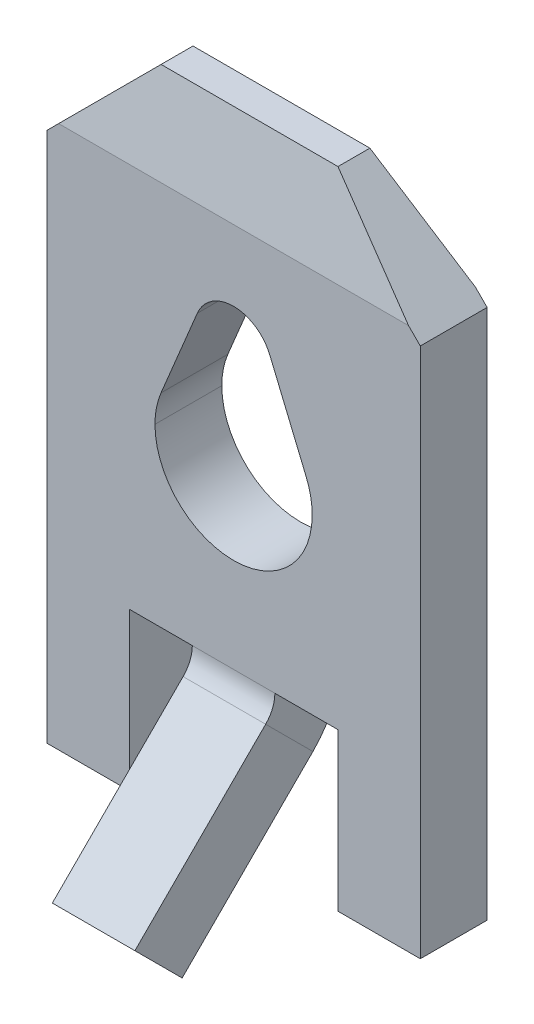
ISO-10303-21;
HEADER;
FILE_DESCRIPTION(('STEP AP214'),'2;1');
FILE_NAME('part.step','',(''),(''),'','','');
FILE_SCHEMA(('AUTOMOTIVE_DESIGN { 1 0 10303 214 1 1 1 1 }'));
ENDSEC;
DATA;
#1=APPLICATION_CONTEXT('core data for automotive mechanical design processes');
#2=APPLICATION_PROTOCOL_DEFINITION('international standard','automotive_design',2000,#1);
#3=PRODUCT_CONTEXT('',#1,'mechanical');
#4=PRODUCT('Part','Part','',(#3));
#5=PRODUCT_RELATED_PRODUCT_CATEGORY('part','',(#4));
#6=PRODUCT_DEFINITION_FORMATION('','',#4);
#7=PRODUCT_DEFINITION_CONTEXT('part definition',#1,'design');
#8=PRODUCT_DEFINITION('design','',#6,#7);
#9=PRODUCT_DEFINITION_SHAPE('','',#8);
#10=(LENGTH_UNIT() NAMED_UNIT(*) SI_UNIT(.MILLI.,.METRE.));
#11=(NAMED_UNIT(*) PLANE_ANGLE_UNIT() SI_UNIT($,.RADIAN.));
#12=(NAMED_UNIT(*) SI_UNIT($,.STERADIAN.) SOLID_ANGLE_UNIT());
#13=UNCERTAINTY_MEASURE_WITH_UNIT(LENGTH_MEASURE(1.E-05),#10,'distance_accuracy_value','');
#14=(GEOMETRIC_REPRESENTATION_CONTEXT(3) GLOBAL_UNCERTAINTY_ASSIGNED_CONTEXT((#13)) GLOBAL_UNIT_ASSIGNED_CONTEXT((#10,
#11,#12)) REPRESENTATION_CONTEXT('',''));
#15=CARTESIAN_POINT('',(0.,0.,0.));
#16=DIRECTION('',(0.,0.,1.));
#17=DIRECTION('',(1.,0.,0.));
#18=AXIS2_PLACEMENT_3D('',#15,#16,#17);
#19=CARTESIAN_POINT('',(2.9,3.84848421169575,2.03213960570058));
#20=DIRECTION('',(-1.,0.,0.));
#21=DIRECTION('',(0.,0.,1.));
#22=AXIS2_PLACEMENT_3D('',#19,#20,#21);
#23=PLANE('',#22);
#24=DIRECTION('',(0.,-0.707106781186544,-0.707106781186551));
#25=VECTOR('',#24,1.);
#26=CARTESIAN_POINT('',(2.9,3.39031190869815,2.49031190869817));
#27=LINE('',#26,#25);
#28=CARTESIAN_POINT('',(2.9,1.86715728752538,0.96715728752538));
#29=VERTEX_POINT('',#28);
#30=CARTESIAN_POINT('',(2.9,1.26611652351681,0.366116523516817));
#31=VERTEX_POINT('',#30);
#32=EDGE_CURVE('E302',#29,#31,#27,.T.);
#33=ORIENTED_EDGE('',*,*,#32,.F.);
#34=DIRECTION('',(0.,-0.707106781186547,0.707106781186549));
#35=VECTOR('',#34,1.);
#36=CARTESIAN_POINT('',(2.9,2.32532959052296,0.508984984527799));
#37=LINE('',#36,#35);
#38=CARTESIAN_POINT('',(2.9,0.204009246963322,2.63030532808745));
#39=VERTEX_POINT('',#38);
#40=EDGE_CURVE('E329',#29,#39,#37,.T.);
#41=ORIENTED_EDGE('',*,*,#40,.T.);
#42=DIRECTION('',(0.,0.707106781186549,0.707106781186546));
#43=VECTOR('',#42,1.);
#44=CARTESIAN_POINT('',(2.9,-0.397031517045243,2.02926456407888));
#45=LINE('',#44,#43);
#46=CARTESIAN_POINT('',(2.9,-0.397031517045243,2.02926456407888));
#47=VERTEX_POINT('',#46);
#48=EDGE_CURVE('E335',#47,#39,#45,.T.);
#49=ORIENTED_EDGE('',*,*,#48,.F.);
#50=DIRECTION('',(0.,0.707106781186547,-0.707106781186549));
#51=VECTOR('',#50,1.);
#52=CARTESIAN_POINT('',(2.9,1.72428882651439,-0.0920557794807646));
#53=LINE('',#52,#51);
#54=EDGE_CURVE('E11',#47,#31,#53,.T.);
#55=ORIENTED_EDGE('',*,*,#54,.T.);
#56=EDGE_LOOP('',(#33,#41,#49,#55));
#57=FACE_BOUND('',#56,.T.);
#58=ADVANCED_FACE('F16',(#57),#23,.F.);
#59=CARTESIAN_POINT('',(4.75,0.310075264141302,1.32215778289233));
#60=DIRECTION('',(0.,0.707106781186549,0.707106781186547));
#61=DIRECTION('',(1.,0.,0.));
#62=AXIS2_PLACEMENT_3D('',#59,#60,#61);
#63=PLANE('',#62);
#64=DIRECTION('',(-1.,0.,0.));
#65=VECTOR('',#64,1.);
#66=CARTESIAN_POINT('',(4.75,1.26611652351682,0.366116523516815));
#67=LINE('',#66,#65);
#68=CARTESIAN_POINT('',(1.85,1.26611652351682,0.366116523516817));
#69=VERTEX_POINT('',#68);
#70=EDGE_CURVE('E331',#31,#69,#67,.T.);
#71=ORIENTED_EDGE('',*,*,#70,.F.);
#72=ORIENTED_EDGE('',*,*,#54,.F.);
#73=DIRECTION('',(1.,0.,0.));
#74=VECTOR('',#73,1.);
#75=CARTESIAN_POINT('',(1.85,-0.397031517045243,2.02926456407888));
#76=LINE('',#75,#74);
#77=CARTESIAN_POINT('',(1.85,-0.397031517045243,2.02926456407888));
#78=VERTEX_POINT('',#77);
#79=EDGE_CURVE('E330',#78,#47,#76,.T.);
#80=ORIENTED_EDGE('',*,*,#79,.F.);
#81=DIRECTION('',(0.,-0.707106781186547,0.707106781186549));
#82=VECTOR('',#81,1.);
#83=CARTESIAN_POINT('',(1.85,1.72428882651439,-0.0920557794807644));
#84=LINE('',#83,#82);
#85=EDGE_CURVE('E27',#69,#78,#84,.T.);
#86=ORIENTED_EDGE('',*,*,#85,.F.);
#87=EDGE_LOOP('',(#71,#72,#80,#86));
#88=FACE_BOUND('',#87,.T.);
#89=ADVANCED_FACE('F576',(#88),#63,.F.);
#90=CARTESIAN_POINT('',(1.85,3.84848421169575,2.03213960570058));
#91=DIRECTION('',(1.,0.,0.));
#92=DIRECTION('',(0.,0.,-1.));
#93=AXIS2_PLACEMENT_3D('',#90,#91,#92);
#94=PLANE('',#93);
#95=DIRECTION('',(0.,0.707106781186544,0.707106781186551));
#96=VECTOR('',#95,1.);
#97=CARTESIAN_POINT('',(1.85,3.39031190869815,2.49031190869817));
#98=LINE('',#97,#96);
#99=CARTESIAN_POINT('',(1.85,1.86715728752538,0.967157287525381));
#100=VERTEX_POINT('',#99);
#101=EDGE_CURVE('E300',#69,#100,#98,.T.);
#102=ORIENTED_EDGE('',*,*,#101,.F.);
#103=ORIENTED_EDGE('',*,*,#85,.T.);
#104=DIRECTION('',(0.,-0.707106781186549,-0.707106781186546));
#105=VECTOR('',#104,1.);
#106=CARTESIAN_POINT('',(1.85,0.204009246963322,2.63030532808745));
#107=LINE('',#106,#105);
#108=CARTESIAN_POINT('',(1.85,0.204009246963322,2.63030532808745));
#109=VERTEX_POINT('',#108);
#110=EDGE_CURVE('E415',#109,#78,#107,.T.);
#111=ORIENTED_EDGE('',*,*,#110,.F.);
#112=DIRECTION('',(0.,0.707106781186547,-0.707106781186549));
#113=VECTOR('',#112,1.);
#114=CARTESIAN_POINT('',(1.85,2.32532959052296,0.5089849845278));
#115=LINE('',#114,#113);
#116=EDGE_CURVE('E326',#109,#100,#115,.T.);
#117=ORIENTED_EDGE('',*,*,#116,.T.);
#118=EDGE_LOOP('',(#102,#103,#111,#117));
#119=FACE_BOUND('',#118,.T.);
#120=ADVANCED_FACE('F574',(#119),#94,.F.);
#121=CARTESIAN_POINT('',(4.75,5.79015281833704,-2.95583824328629));
#122=DIRECTION('',(0.,-0.707106781186549,-0.707106781186547));
#123=DIRECTION('',(0.,0.707106781186547,-0.707106781186549));
#124=AXIS2_PLACEMENT_3D('',#121,#122,#123);
#125=PLANE('',#124);
#126=DIRECTION('',(1.,0.,0.));
#127=VECTOR('',#126,1.);
#128=CARTESIAN_POINT('',(4.75,1.86715728752538,0.967157287525383));
#129=LINE('',#128,#127);
#130=EDGE_CURVE('E20',#100,#29,#129,.T.);
#131=ORIENTED_EDGE('',*,*,#130,.F.);
#132=ORIENTED_EDGE('',*,*,#116,.F.);
#133=DIRECTION('',(-1.,0.,0.));
#134=VECTOR('',#133,1.);
#135=CARTESIAN_POINT('',(2.9,0.204009246963322,2.63030532808745));
#136=LINE('',#135,#134);
#137=EDGE_CURVE('E419',#39,#109,#136,.T.);
#138=ORIENTED_EDGE('',*,*,#137,.F.);
#139=ORIENTED_EDGE('',*,*,#40,.F.);
#140=EDGE_LOOP('',(#131,#132,#138,#139));
#141=FACE_BOUND('',#140,.T.);
#142=ADVANCED_FACE('F573',(#141),#125,.F.);
#143=CARTESIAN_POINT('',(0.,-0.397031517045243,2.02926456407888));
#144=DIRECTION('',(0.,-0.707106781186546,0.707106781186549));
#145=DIRECTION('',(-1.,0.,0.));
#146=AXIS2_PLACEMENT_3D('',#143,#144,#145);
#147=PLANE('',#146);
#148=ORIENTED_EDGE('',*,*,#48,.T.);
#149=ORIENTED_EDGE('',*,*,#137,.T.);
#150=ORIENTED_EDGE('',*,*,#110,.T.);
#151=ORIENTED_EDGE('',*,*,#79,.T.);
#152=EDGE_LOOP('',(#148,#149,#150,#151));
#153=FACE_BOUND('',#152,.T.);
#154=ADVANCED_FACE('F567',(#153),#147,.T.);
#155=CARTESIAN_POINT('',(0.876719746353102,2.15,1.25));
#156=DIRECTION('',(1.,0.,0.));
#157=DIRECTION('',(0.,1.,0.));
#158=AXIS2_PLACEMENT_3D('',#155,#156,#157);
#159=CYLINDRICAL_SURFACE('',#158,1.25);
#160=CARTESIAN_POINT('',(2.9,2.15,1.25));
#161=DIRECTION('',(1.,0.,0.));
#162=DIRECTION('',(0.,1.,0.));
#163=AXIS2_PLACEMENT_3D('',#160,#161,#162);
#164=CIRCLE('',#163,1.25);
#165=CARTESIAN_POINT('',(2.9,2.15,0.));
#166=VERTEX_POINT('',#165);
#167=EDGE_CURVE('E306',#31,#166,#164,.T.);
#168=ORIENTED_EDGE('',*,*,#167,.F.);
#169=ORIENTED_EDGE('',*,*,#70,.T.);
#170=CARTESIAN_POINT('',(1.85,2.15,1.25));
#171=DIRECTION('',(-1.,0.,0.));
#172=DIRECTION('',(0.,1.,0.));
#173=AXIS2_PLACEMENT_3D('',#170,#171,#172);
#174=CIRCLE('',#173,1.25);
#175=CARTESIAN_POINT('',(1.85,2.15,0.));
#176=VERTEX_POINT('',#175);
#177=EDGE_CURVE('E296',#176,#69,#174,.T.);
#178=ORIENTED_EDGE('',*,*,#177,.F.);
#179=DIRECTION('',(-1.,0.,0.));
#180=VECTOR('',#179,1.);
#181=CARTESIAN_POINT('',(4.75,2.15,0.));
#182=LINE('',#181,#180);
#183=EDGE_CURVE('E278',#166,#176,#182,.T.);
#184=ORIENTED_EDGE('',*,*,#183,.F.);
#185=EDGE_LOOP('',(#168,#169,#178,#184));
#186=FACE_BOUND('',#185,.T.);
#187=ADVANCED_FACE('F595',(#186),#159,.T.);
#188=CARTESIAN_POINT('',(0.876719746353102,2.15,1.25));
#189=DIRECTION('',(1.,0.,0.));
#190=DIRECTION('',(0.,1.,0.));
#191=AXIS2_PLACEMENT_3D('',#188,#189,#190);
#192=CYLINDRICAL_SURFACE('',#191,0.4);
#193=CARTESIAN_POINT('',(2.9,2.15,1.25));
#194=DIRECTION('',(1.,0.,0.));
#195=DIRECTION('',(0.,0.,1.));
#196=AXIS2_PLACEMENT_3D('',#193,#194,#195);
#197=CIRCLE('',#196,0.4);
#198=CARTESIAN_POINT('',(2.9,2.15,0.85));
#199=VERTEX_POINT('',#198);
#200=EDGE_CURVE('E375',#29,#199,#197,.T.);
#201=ORIENTED_EDGE('',*,*,#200,.T.);
#202=DIRECTION('',(1.,0.,0.));
#203=VECTOR('',#202,1.);
#204=CARTESIAN_POINT('',(4.75,2.15,0.85));
#205=LINE('',#204,#203);
#206=CARTESIAN_POINT('',(1.85,2.15,0.85));
#207=VERTEX_POINT('',#206);
#208=EDGE_CURVE('E272',#207,#199,#205,.T.);
#209=ORIENTED_EDGE('',*,*,#208,.F.);
#210=CARTESIAN_POINT('',(1.85,2.15,1.25));
#211=DIRECTION('',(-1.,0.,0.));
#212=DIRECTION('',(0.,1.,0.));
#213=AXIS2_PLACEMENT_3D('',#210,#211,#212);
#214=CIRCLE('',#213,0.4);
#215=EDGE_CURVE('E307',#207,#100,#214,.T.);
#216=ORIENTED_EDGE('',*,*,#215,.T.);
#217=ORIENTED_EDGE('',*,*,#130,.T.);
#218=EDGE_LOOP('',(#201,#209,#216,#217));
#219=FACE_BOUND('',#218,.T.);
#220=ADVANCED_FACE('F469',(#219),#192,.F.);
#221=CARTESIAN_POINT('',(2.9,2.15,1.25));
#222=DIRECTION('',(-1.,0.,0.));
#223=DIRECTION('',(0.,0.,1.));
#224=AXIS2_PLACEMENT_3D('',#221,#222,#223);
#225=PLANE('',#224);
#226=ORIENTED_EDGE('',*,*,#32,.T.);
#227=ORIENTED_EDGE('',*,*,#167,.T.);
#228=DIRECTION('',(0.,0.,-1.));
#229=VECTOR('',#228,1.);
#230=CARTESIAN_POINT('',(2.9,2.15,3.0040659228538));
#231=LINE('',#230,#229);
#232=EDGE_CURVE('E414',#199,#166,#231,.T.);
#233=ORIENTED_EDGE('',*,*,#232,.F.);
#234=ORIENTED_EDGE('',*,*,#200,.F.);
#235=EDGE_LOOP('',(#226,#227,#233,#234));
#236=FACE_BOUND('',#235,.T.);
#237=ADVANCED_FACE('F479',(#236),#225,.F.);
#238=CARTESIAN_POINT('',(1.85,2.15,1.25));
#239=DIRECTION('',(1.,0.,0.));
#240=DIRECTION('',(0.,-1.,0.));
#241=AXIS2_PLACEMENT_3D('',#238,#239,#240);
#242=PLANE('',#241);
#243=DIRECTION('',(0.,0.,-1.));
#244=VECTOR('',#243,1.);
#245=CARTESIAN_POINT('',(1.85,2.15,3.0040659228538));
#246=LINE('',#245,#244);
#247=EDGE_CURVE('E301',#207,#176,#246,.T.);
#248=ORIENTED_EDGE('',*,*,#247,.T.);
#249=ORIENTED_EDGE('',*,*,#177,.T.);
#250=ORIENTED_EDGE('',*,*,#101,.T.);
#251=ORIENTED_EDGE('',*,*,#215,.F.);
#252=EDGE_LOOP('',(#248,#249,#250,#251));
#253=FACE_BOUND('',#252,.T.);
#254=ADVANCED_FACE('F624',(#253),#242,.F.);
#255=CARTESIAN_POINT('',(1.05,2.15,3.0040659228538));
#256=DIRECTION('',(-1.,0.,0.));
#257=DIRECTION('',(0.,0.,1.));
#258=AXIS2_PLACEMENT_3D('',#255,#256,#257);
#259=PLANE('',#258);
#260=DIRECTION('',(0.,-1.,0.));
#261=VECTOR('',#260,1.);
#262=CARTESIAN_POINT('',(1.05,2.15,0.85));
#263=LINE('',#262,#261);
#264=CARTESIAN_POINT('',(1.05,2.15,0.85));
#265=VERTEX_POINT('',#264);
#266=CARTESIAN_POINT('',(1.05,0.15,0.85));
#267=VERTEX_POINT('',#266);
#268=EDGE_CURVE('E289',#265,#267,#263,.T.);
#269=ORIENTED_EDGE('',*,*,#268,.T.);
#270=DIRECTION('',(0.,0.,-1.));
#271=VECTOR('',#270,1.);
#272=CARTESIAN_POINT('',(1.05,0.149999999999999,3.0040659228538));
#273=LINE('',#272,#271);
#274=CARTESIAN_POINT('',(1.05,0.15,0.));
#275=VERTEX_POINT('',#274);
#276=EDGE_CURVE('E308',#267,#275,#273,.T.);
#277=ORIENTED_EDGE('',*,*,#276,.T.);
#278=DIRECTION('',(0.,1.,0.));
#279=VECTOR('',#278,1.);
#280=CARTESIAN_POINT('',(1.05,2.15,0.));
#281=LINE('',#280,#279);
#282=CARTESIAN_POINT('',(1.05,2.15,0.));
#283=VERTEX_POINT('',#282);
#284=EDGE_CURVE('E277',#275,#283,#281,.T.);
#285=ORIENTED_EDGE('',*,*,#284,.T.);
#286=DIRECTION('',(0.,0.,-1.));
#287=VECTOR('',#286,1.);
#288=CARTESIAN_POINT('',(1.05,2.15,3.0040659228538));
#289=LINE('',#288,#287);
#290=EDGE_CURVE('E348',#265,#283,#289,.T.);
#291=ORIENTED_EDGE('',*,*,#290,.F.);
#292=EDGE_LOOP('',(#269,#277,#285,#291));
#293=FACE_BOUND('',#292,.T.);
#294=ADVANCED_FACE('F626',(#293),#259,.F.);
#295=CARTESIAN_POINT('',(1.85,2.15,3.0040659228538));
#296=DIRECTION('',(0.,1.,0.));
#297=DIRECTION('',(0.,0.,-1.));
#298=AXIS2_PLACEMENT_3D('',#295,#296,#297);
#299=PLANE('',#298);
#300=DIRECTION('',(-1.,0.,0.));
#301=VECTOR('',#300,1.);
#302=CARTESIAN_POINT('',(1.85,2.15,0.85));
#303=LINE('',#302,#301);
#304=EDGE_CURVE('E283',#207,#265,#303,.T.);
#305=ORIENTED_EDGE('',*,*,#304,.T.);
#306=ORIENTED_EDGE('',*,*,#290,.T.);
#307=DIRECTION('',(1.,0.,0.));
#308=VECTOR('',#307,1.);
#309=CARTESIAN_POINT('',(1.85,2.15,0.));
#310=LINE('',#309,#308);
#311=EDGE_CURVE('E273',#283,#176,#310,.T.);
#312=ORIENTED_EDGE('',*,*,#311,.T.);
#313=ORIENTED_EDGE('',*,*,#247,.F.);
#314=EDGE_LOOP('',(#305,#306,#312,#313));
#315=FACE_BOUND('',#314,.T.);
#316=ADVANCED_FACE('F645',(#315),#299,.F.);
#317=CARTESIAN_POINT('',(2.9,2.15,3.0040659228538));
#318=DIRECTION('',(0.,1.,0.));
#319=DIRECTION('',(1.,0.,0.));
#320=AXIS2_PLACEMENT_3D('',#317,#318,#319);
#321=PLANE('',#320);
#322=DIRECTION('',(-1.,0.,0.));
#323=VECTOR('',#322,1.);
#324=CARTESIAN_POINT('',(2.9,2.15,0.85));
#325=LINE('',#324,#323);
#326=CARTESIAN_POINT('',(3.7,2.15,0.85));
#327=VERTEX_POINT('',#326);
#328=EDGE_CURVE('E267',#327,#199,#325,.T.);
#329=ORIENTED_EDGE('',*,*,#328,.T.);
#330=ORIENTED_EDGE('',*,*,#232,.T.);
#331=DIRECTION('',(1.,0.,0.));
#332=VECTOR('',#331,1.);
#333=CARTESIAN_POINT('',(2.9,2.15,0.));
#334=LINE('',#333,#332);
#335=CARTESIAN_POINT('',(3.7,2.15,0.));
#336=VERTEX_POINT('',#335);
#337=EDGE_CURVE('E251',#166,#336,#334,.T.);
#338=ORIENTED_EDGE('',*,*,#337,.T.);
#339=DIRECTION('',(0.,0.,-1.));
#340=VECTOR('',#339,1.);
#341=CARTESIAN_POINT('',(3.7,2.15,3.0040659228538));
#342=LINE('',#341,#340);
#343=EDGE_CURVE('E422',#327,#336,#342,.T.);
#344=ORIENTED_EDGE('',*,*,#343,.F.);
#345=EDGE_LOOP('',(#329,#330,#338,#344));
#346=FACE_BOUND('',#345,.T.);
#347=ADVANCED_FACE('F485',(#346),#321,.F.);
#348=CARTESIAN_POINT('',(3.7,2.15,3.0040659228538));
#349=DIRECTION('',(1.,0.,0.));
#350=DIRECTION('',(0.,-1.,0.));
#351=AXIS2_PLACEMENT_3D('',#348,#349,#350);
#352=PLANE('',#351);
#353=DIRECTION('',(0.,1.,0.));
#354=VECTOR('',#353,1.);
#355=CARTESIAN_POINT('',(3.7,2.15,0.85));
#356=LINE('',#355,#354);
#357=CARTESIAN_POINT('',(3.7,0.15,0.85));
#358=VERTEX_POINT('',#357);
#359=EDGE_CURVE('E271',#358,#327,#356,.T.);
#360=ORIENTED_EDGE('',*,*,#359,.T.);
#361=ORIENTED_EDGE('',*,*,#343,.T.);
#362=DIRECTION('',(0.,-1.,0.));
#363=VECTOR('',#362,1.);
#364=CARTESIAN_POINT('',(3.7,2.15,0.));
#365=LINE('',#364,#363);
#366=CARTESIAN_POINT('',(3.7,0.15,0.));
#367=VERTEX_POINT('',#366);
#368=EDGE_CURVE('E376',#336,#367,#365,.T.);
#369=ORIENTED_EDGE('',*,*,#368,.T.);
#370=DIRECTION('',(0.,0.,-1.));
#371=VECTOR('',#370,1.);
#372=CARTESIAN_POINT('',(3.7,0.149999999999999,3.0040659228538));
#373=LINE('',#372,#371);
#374=EDGE_CURVE('E291',#358,#367,#373,.T.);
#375=ORIENTED_EDGE('',*,*,#374,.F.);
#376=EDGE_LOOP('',(#360,#361,#369,#375));
#377=FACE_BOUND('',#376,.T.);
#378=ADVANCED_FACE('F490',(#377),#352,.F.);
#379=CARTESIAN_POINT('',(1.91346153846154,5.84230769230769,-3.44093010681705));
#380=DIRECTION('',(-0.923076923076923,0.384615384615385,0.));
#381=DIRECTION('',(0.,0.,1.));
#382=AXIS2_PLACEMENT_3D('',#379,#380,#381);
#383=PLANE('',#382);
#384=DIRECTION('',(0.384615384615385,0.923076923076923,0.));
#385=VECTOR('',#384,1.);
#386=CARTESIAN_POINT('',(1.91346153846154,5.84230769230769,0.));
#387=LINE('',#386,#385);
#388=CARTESIAN_POINT('',(1.45192307692308,4.73461538461538,0.));
#389=VERTEX_POINT('',#388);
#390=CARTESIAN_POINT('',(1.91346153846154,5.84230769230769,0.));
#391=VERTEX_POINT('',#390);
#392=EDGE_CURVE('E284',#389,#391,#387,.T.);
#393=ORIENTED_EDGE('',*,*,#392,.T.);
#394=DIRECTION('',(0.,0.,1.));
#395=VECTOR('',#394,1.);
#396=CARTESIAN_POINT('',(1.91346153846154,5.84230769230769,-3.44093010681705));
#397=LINE('',#396,#395);
#398=CARTESIAN_POINT('',(1.91346153846154,5.84230769230769,0.85));
#399=VERTEX_POINT('',#398);
#400=EDGE_CURVE('E408',#391,#399,#397,.T.);
#401=ORIENTED_EDGE('',*,*,#400,.T.);
#402=DIRECTION('',(-0.384615384615385,-0.923076923076923,0.));
#403=VECTOR('',#402,1.);
#404=CARTESIAN_POINT('',(1.91346153846154,5.84230769230769,0.85));
#405=LINE('',#404,#403);
#406=CARTESIAN_POINT('',(1.45192307692308,4.73461538461538,0.85));
#407=VERTEX_POINT('',#406);
#408=EDGE_CURVE('E436',#399,#407,#405,.T.);
#409=ORIENTED_EDGE('',*,*,#408,.T.);
#410=DIRECTION('',(0.,0.,1.));
#411=VECTOR('',#410,1.);
#412=CARTESIAN_POINT('',(1.45192307692308,4.73461538461538,-3.44093010681705));
#413=LINE('',#412,#411);
#414=EDGE_CURVE('E411',#389,#407,#413,.T.);
#415=ORIENTED_EDGE('',*,*,#414,.F.);
#416=EDGE_LOOP('',(#393,#401,#409,#415));
#417=FACE_BOUND('',#416,.T.);
#418=ADVANCED_FACE('F613',(#417),#383,.F.);
#419=CARTESIAN_POINT('',(2.375,4.35,-3.44093010681705));
#420=DIRECTION('',(0.,0.,1.));
#421=DIRECTION('',(1.,0.,0.));
#422=AXIS2_PLACEMENT_3D('',#419,#420,#421);
#423=CYLINDRICAL_SURFACE('',#422,1.);
#424=DIRECTION('',(0.,0.,1.));
#425=VECTOR('',#424,1.);
#426=CARTESIAN_POINT('',(1.375,4.35,-3.44093010681705));
#427=LINE('',#426,#425);
#428=CARTESIAN_POINT('',(1.375,4.35,0.));
#429=VERTEX_POINT('',#428);
#430=CARTESIAN_POINT('',(1.375,4.35,0.85));
#431=VERTEX_POINT('',#430);
#432=EDGE_CURVE('E380',#429,#431,#427,.T.);
#433=ORIENTED_EDGE('',*,*,#432,.F.);
#434=CARTESIAN_POINT('',(2.375,4.35,0.));
#435=DIRECTION('',(0.,0.,-1.));
#436=DIRECTION('',(0.,-1.,0.));
#437=AXIS2_PLACEMENT_3D('',#434,#435,#436);
#438=CIRCLE('',#437,1.);
#439=EDGE_CURVE('E279',#429,#389,#438,.T.);
#440=ORIENTED_EDGE('',*,*,#439,.T.);
#441=ORIENTED_EDGE('',*,*,#414,.T.);
#442=CARTESIAN_POINT('',(2.375,4.35,0.85));
#443=DIRECTION('',(0.,0.,1.));
#444=DIRECTION('',(1.,0.,0.));
#445=AXIS2_PLACEMENT_3D('',#442,#443,#444);
#446=CIRCLE('',#445,1.);
#447=EDGE_CURVE('E241',#407,#431,#446,.T.);
#448=ORIENTED_EDGE('',*,*,#447,.T.);
#449=EDGE_LOOP('',(#433,#440,#441,#448));
#450=FACE_BOUND('',#449,.T.);
#451=ADVANCED_FACE('F594',(#450),#423,.F.);
#452=CARTESIAN_POINT('',(2.84243697464802,5.82748992853653,-3.44093010681705));
#453=DIRECTION('',(0.922994271128754,0.384813689288076,0.));
#454=DIRECTION('',(0.,0.,-1.));
#455=AXIS2_PLACEMENT_3D('',#452,#453,#454);
#456=PLANE('',#455);
#457=DIRECTION('',(0.384813689288076,-0.922994271128754,0.));
#458=VECTOR('',#457,1.);
#459=CARTESIAN_POINT('',(2.84243697464802,5.82748992853653,0.));
#460=LINE('',#459,#458);
#461=CARTESIAN_POINT('',(2.84243697464802,5.82748992853653,0.));
#462=VERTEX_POINT('',#461);
#463=CARTESIAN_POINT('',(3.29799427112876,4.73481368928808,0.));
#464=VERTEX_POINT('',#463);
#465=EDGE_CURVE('E247',#462,#464,#460,.T.);
#466=ORIENTED_EDGE('',*,*,#465,.T.);
#467=DIRECTION('',(0.,0.,1.));
#468=VECTOR('',#467,1.);
#469=CARTESIAN_POINT('',(3.29799427112876,4.73481368928808,-3.44093010681705));
#470=LINE('',#469,#468);
#471=CARTESIAN_POINT('',(3.29799427112876,4.73481368928808,0.85));
#472=VERTEX_POINT('',#471);
#473=EDGE_CURVE('E244',#464,#472,#470,.T.);
#474=ORIENTED_EDGE('',*,*,#473,.T.);
#475=DIRECTION('',(-0.384813689288076,0.922994271128754,0.));
#476=VECTOR('',#475,1.);
#477=CARTESIAN_POINT('',(2.84243697464802,5.82748992853653,0.85));
#478=LINE('',#477,#476);
#479=CARTESIAN_POINT('',(2.84243697464802,5.82748992853653,0.85));
#480=VERTEX_POINT('',#479);
#481=EDGE_CURVE('E228',#472,#480,#478,.T.);
#482=ORIENTED_EDGE('',*,*,#481,.T.);
#483=DIRECTION('',(0.,0.,1.));
#484=VECTOR('',#483,1.);
#485=CARTESIAN_POINT('',(2.84243697464802,5.82748992853653,-3.44093010681705));
#486=LINE('',#485,#484);
#487=EDGE_CURVE('E402',#462,#480,#486,.T.);
#488=ORIENTED_EDGE('',*,*,#487,.F.);
#489=EDGE_LOOP('',(#466,#474,#482,#488));
#490=FACE_BOUND('',#489,.T.);
#491=ADVANCED_FACE('F245',(#490),#456,.F.);
#492=CARTESIAN_POINT('',(2.375,5.65,-3.44093010681705));
#493=DIRECTION('',(0.,0.,1.));
#494=DIRECTION('',(1.,0.,0.));
#495=AXIS2_PLACEMENT_3D('',#492,#493,#494);
#496=CYLINDRICAL_SURFACE('',#495,0.5);
#497=CARTESIAN_POINT('',(2.375,5.65,0.));
#498=DIRECTION('',(0.,0.,-1.));
#499=DIRECTION('',(0.,-1.,0.));
#500=AXIS2_PLACEMENT_3D('',#497,#498,#499);
#501=CIRCLE('',#500,0.5);
#502=EDGE_CURVE('E386',#391,#462,#501,.T.);
#503=ORIENTED_EDGE('',*,*,#502,.T.);
#504=ORIENTED_EDGE('',*,*,#487,.T.);
#505=CARTESIAN_POINT('',(2.375,5.65,0.85));
#506=DIRECTION('',(0.,0.,1.));
#507=DIRECTION('',(1.,0.,0.));
#508=AXIS2_PLACEMENT_3D('',#505,#506,#507);
#509=CIRCLE('',#508,0.5);
#510=EDGE_CURVE('E238',#480,#399,#509,.T.);
#511=ORIENTED_EDGE('',*,*,#510,.T.);
#512=ORIENTED_EDGE('',*,*,#400,.F.);
#513=EDGE_LOOP('',(#503,#504,#511,#512));
#514=FACE_BOUND('',#513,.T.);
#515=ADVANCED_FACE('F593',(#514),#496,.F.);
#516=CARTESIAN_POINT('',(3.5,8.15,-1.76776695296637));
#517=DIRECTION('',(-0.707106781186548,-0.707106781186548,0.));
#518=DIRECTION('',(-0.707106781186548,0.707106781186548,0.));
#519=AXIS2_PLACEMENT_3D('',#516,#517,#518);
#520=PLANE('',#519);
#521=DIRECTION('',(0.,0.,1.));
#522=VECTOR('',#521,1.);
#523=CARTESIAN_POINT('',(3.5,8.15,-1.76776695296637));
#524=LINE('',#523,#522);
#525=CARTESIAN_POINT('',(3.5,8.15,0.24139344262295));
#526=VERTEX_POINT('',#525);
#527=CARTESIAN_POINT('',(3.5,8.15,0.647131147540979));
#528=VERTEX_POINT('',#527);
#529=EDGE_CURVE('E363',#526,#528,#524,.T.);
#530=ORIENTED_EDGE('',*,*,#529,.T.);
#531=DIRECTION('',(-0.70116968993079,0.70116968993079,-0.12931408215937));
#532=VECTOR('',#531,1.);
#533=CARTESIAN_POINT('',(4.11454866759705,7.53545133240295,0.760470041155192));
#534=LINE('',#533,#532);
#535=CARTESIAN_POINT('',(4.6,7.05,0.85));
#536=VERTEX_POINT('',#535);
#537=EDGE_CURVE('E295',#536,#528,#534,.T.);
#538=ORIENTED_EDGE('',*,*,#537,.F.);
#539=DIRECTION('',(0.707106781186548,-0.707106781186548,0.));
#540=VECTOR('',#539,1.);
#541=CARTESIAN_POINT('',(3.5,8.15,0.85));
#542=LINE('',#541,#540);
#543=CARTESIAN_POINT('',(4.75,6.9,0.85));
#544=VERTEX_POINT('',#543);
#545=EDGE_CURVE('E457',#536,#544,#542,.T.);
#546=ORIENTED_EDGE('',*,*,#545,.T.);
#547=DIRECTION('',(0.,0.,1.));
#548=VECTOR('',#547,1.);
#549=CARTESIAN_POINT('',(4.75,6.9,-1.76776695296637));
#550=LINE('',#549,#548);
#551=CARTESIAN_POINT('',(4.75,6.9,0.));
#552=VERTEX_POINT('',#551);
#553=EDGE_CURVE('E314',#552,#544,#550,.T.);
#554=ORIENTED_EDGE('',*,*,#553,.F.);
#555=DIRECTION('',(-0.707106781186548,0.707106781186548,0.));
#556=VECTOR('',#555,1.);
#557=CARTESIAN_POINT('',(3.5,8.15,0.));
#558=LINE('',#557,#556);
#559=CARTESIAN_POINT('',(4.6,7.05,0.));
#560=VERTEX_POINT('',#559);
#561=EDGE_CURVE('E320',#552,#560,#558,.T.);
#562=ORIENTED_EDGE('',*,*,#561,.T.);
#563=DIRECTION('',(0.698744344369524,-0.698744344369524,-0.153338457091523));
#564=VECTOR('',#563,1.);
#565=CARTESIAN_POINT('',(4.67323654881826,6.97676345118174,-0.0160716569500576));
#566=LINE('',#565,#564);
#567=EDGE_CURVE('E321',#526,#560,#566,.T.);
#568=ORIENTED_EDGE('',*,*,#567,.F.);
#569=EDGE_LOOP('',(#530,#538,#546,#554,#562,#568));
#570=FACE_BOUND('',#569,.T.);
#571=ADVANCED_FACE('F545',(#570),#520,.F.);
#572=CARTESIAN_POINT('',(0.,6.9,-1.76776695296637));
#573=DIRECTION('',(0.707106781186548,-0.707106781186548,0.));
#574=DIRECTION('',(0.,0.,-1.));
#575=AXIS2_PLACEMENT_3D('',#572,#573,#574);
#576=PLANE('',#575);
#577=DIRECTION('',(-0.707106781186548,-0.707106781186548,0.));
#578=VECTOR('',#577,1.);
#579=CARTESIAN_POINT('',(0.,6.9,0.));
#580=LINE('',#579,#578);
#581=CARTESIAN_POINT('',(0.15,7.05,0.));
#582=VERTEX_POINT('',#581);
#583=CARTESIAN_POINT('',(0.,6.9,0.));
#584=VERTEX_POINT('',#583);
#585=EDGE_CURVE('E357',#582,#584,#580,.T.);
#586=ORIENTED_EDGE('',*,*,#585,.T.);
#587=DIRECTION('',(0.,0.,1.));
#588=VECTOR('',#587,1.);
#589=CARTESIAN_POINT('',(0.,6.9,-1.76776695296637));
#590=LINE('',#589,#588);
#591=CARTESIAN_POINT('',(0.,6.9,0.85));
#592=VERTEX_POINT('',#591);
#593=EDGE_CURVE('E399',#584,#592,#590,.T.);
#594=ORIENTED_EDGE('',*,*,#593,.T.);
#595=DIRECTION('',(0.707106781186548,0.707106781186548,0.));
#596=VECTOR('',#595,1.);
#597=CARTESIAN_POINT('',(0.,6.9,0.85));
#598=LINE('',#597,#596);
#599=CARTESIAN_POINT('',(0.15,7.05,0.85));
#600=VERTEX_POINT('',#599);
#601=EDGE_CURVE('E498',#592,#600,#598,.T.);
#602=ORIENTED_EDGE('',*,*,#601,.T.);
#603=DIRECTION('',(-0.70116968993079,-0.70116968993079,0.12931408215937));
#604=VECTOR('',#603,1.);
#605=CARTESIAN_POINT('',(2.97073626927174,9.87073626927174,0.329782245421185));
#606=LINE('',#605,#604);
#607=CARTESIAN_POINT('',(1.25,8.15,0.647131147540979));
#608=VERTEX_POINT('',#607);
#609=EDGE_CURVE('E393',#608,#600,#606,.T.);
#610=ORIENTED_EDGE('',*,*,#609,.F.);
#611=DIRECTION('',(0.,0.,1.));
#612=VECTOR('',#611,1.);
#613=CARTESIAN_POINT('',(1.25,8.15,-1.76776695296637));
#614=LINE('',#613,#612);
#615=CARTESIAN_POINT('',(1.25,8.15,0.24139344262295));
#616=VERTEX_POINT('',#615);
#617=EDGE_CURVE('E324',#616,#608,#614,.T.);
#618=ORIENTED_EDGE('',*,*,#617,.F.);
#619=DIRECTION('',(0.698744344369524,0.698744344369524,0.153338457091523));
#620=VECTOR('',#619,1.);
#621=CARTESIAN_POINT('',(2.39592083042662,9.29592083042662,0.492864146468432));
#622=LINE('',#621,#620);
#623=EDGE_CURVE('E369',#582,#616,#622,.T.);
#624=ORIENTED_EDGE('',*,*,#623,.F.);
#625=EDGE_LOOP('',(#586,#594,#602,#610,#618,#624));
#626=FACE_BOUND('',#625,.T.);
#627=ADVANCED_FACE('F539',(#626),#576,.F.);
#628=CARTESIAN_POINT('',(0.,0.,0.));
#629=DIRECTION('',(1.,0.,0.));
#630=DIRECTION('',(0.,1.,0.));
#631=AXIS2_PLACEMENT_3D('',#628,#629,#630);
#632=PLANE('',#631);
#633=DIRECTION('',(0.,-1.,0.));
#634=VECTOR('',#633,1.);
#635=CARTESIAN_POINT('',(0.,7.05,0.85));
#636=LINE('',#635,#634);
#637=CARTESIAN_POINT('',(0.,0.15,0.85));
#638=VERTEX_POINT('',#637);
#639=EDGE_CURVE('E290',#592,#638,#636,.T.);
#640=ORIENTED_EDGE('',*,*,#639,.F.);
#641=ORIENTED_EDGE('',*,*,#593,.F.);
#642=DIRECTION('',(0.,1.,0.));
#643=VECTOR('',#642,1.);
#644=CARTESIAN_POINT('',(0.,0.15,0.));
#645=LINE('',#644,#643);
#646=CARTESIAN_POINT('',(0.,0.15,0.));
#647=VERTEX_POINT('',#646);
#648=EDGE_CURVE('E353',#647,#584,#645,.T.);
#649=ORIENTED_EDGE('',*,*,#648,.F.);
#650=DIRECTION('',(0.,0.,-1.));
#651=VECTOR('',#650,1.);
#652=CARTESIAN_POINT('',(0.,0.15,0.));
#653=LINE('',#652,#651);
#654=EDGE_CURVE('E311',#638,#647,#653,.T.);
#655=ORIENTED_EDGE('',*,*,#654,.F.);
#656=EDGE_LOOP('',(#640,#641,#649,#655));
#657=FACE_BOUND('',#656,.T.);
#658=ADVANCED_FACE('F18',(#657),#632,.F.);
#659=CARTESIAN_POINT('',(4.75,0.,0.));
#660=DIRECTION('',(1.,0.,0.));
#661=DIRECTION('',(0.,1.,0.));
#662=AXIS2_PLACEMENT_3D('',#659,#660,#661);
#663=PLANE('',#662);
#664=ORIENTED_EDGE('',*,*,#553,.T.);
#665=DIRECTION('',(0.,-1.,0.));
#666=VECTOR('',#665,1.);
#667=CARTESIAN_POINT('',(4.75,7.05,0.85));
#668=LINE('',#667,#666);
#669=CARTESIAN_POINT('',(4.75,0.15,0.85));
#670=VERTEX_POINT('',#669);
#671=EDGE_CURVE('E446',#544,#670,#668,.T.);
#672=ORIENTED_EDGE('',*,*,#671,.T.);
#673=DIRECTION('',(0.,0.,-1.));
#674=VECTOR('',#673,1.);
#675=CARTESIAN_POINT('',(4.75,0.15,0.));
#676=LINE('',#675,#674);
#677=CARTESIAN_POINT('',(4.75,0.15,0.));
#678=VERTEX_POINT('',#677);
#679=EDGE_CURVE('E294',#670,#678,#676,.T.);
#680=ORIENTED_EDGE('',*,*,#679,.T.);
#681=DIRECTION('',(0.,1.,0.));
#682=VECTOR('',#681,1.);
#683=CARTESIAN_POINT('',(4.75,0.15,0.));
#684=LINE('',#683,#682);
#685=EDGE_CURVE('E315',#678,#552,#684,.T.);
#686=ORIENTED_EDGE('',*,*,#685,.T.);
#687=EDGE_LOOP('',(#664,#672,#680,#686));
#688=FACE_BOUND('',#687,.T.);
#689=ADVANCED_FACE('F648',(#688),#663,.T.);
#690=CARTESIAN_POINT('',(4.75,0.15,0.));
#691=DIRECTION('',(0.,1.,0.));
#692=DIRECTION('',(1.,0.,0.));
#693=AXIS2_PLACEMENT_3D('',#690,#691,#692);
#694=PLANE('',#693);
#695=DIRECTION('',(-1.,0.,0.));
#696=VECTOR('',#695,1.);
#697=CARTESIAN_POINT('',(4.75,0.15,0.85));
#698=LINE('',#697,#696);
#699=EDGE_CURVE('E442',#670,#358,#698,.T.);
#700=ORIENTED_EDGE('',*,*,#699,.T.);
#701=ORIENTED_EDGE('',*,*,#374,.T.);
#702=DIRECTION('',(-1.,0.,0.));
#703=VECTOR('',#702,1.);
#704=CARTESIAN_POINT('',(4.75,0.15,0.));
#705=LINE('',#704,#703);
#706=EDGE_CURVE('E319',#678,#367,#705,.T.);
#707=ORIENTED_EDGE('',*,*,#706,.F.);
#708=ORIENTED_EDGE('',*,*,#679,.F.);
#709=EDGE_LOOP('',(#700,#701,#707,#708));
#710=FACE_BOUND('',#709,.T.);
#711=ADVANCED_FACE('F634',(#710),#694,.F.);
#712=CARTESIAN_POINT('',(4.75,8.15,0.647131147540979));
#713=DIRECTION('',(0.,-0.181367589437408,-0.983415373838371));
#714=DIRECTION('',(0.,-0.983415373838371,0.181367589437408));
#715=AXIS2_PLACEMENT_3D('',#712,#713,#714);
#716=PLANE('',#715);
#717=DIRECTION('',(-1.,0.,0.));
#718=VECTOR('',#717,1.);
#719=CARTESIAN_POINT('',(4.75,8.15,0.647131147540979));
#720=LINE('',#719,#718);
#721=EDGE_CURVE('E359',#528,#608,#720,.T.);
#722=ORIENTED_EDGE('',*,*,#721,.T.);
#723=ORIENTED_EDGE('',*,*,#609,.T.);
#724=DIRECTION('',(-1.,0.,0.));
#725=VECTOR('',#724,1.);
#726=CARTESIAN_POINT('',(4.75,7.05,0.85));
#727=LINE('',#726,#725);
#728=EDGE_CURVE('E502',#536,#600,#727,.T.);
#729=ORIENTED_EDGE('',*,*,#728,.F.);
#730=ORIENTED_EDGE('',*,*,#537,.T.);
#731=EDGE_LOOP('',(#722,#723,#729,#730));
#732=FACE_BOUND('',#731,.T.);
#733=ADVANCED_FACE('F631',(#732),#716,.F.);
#734=CARTESIAN_POINT('',(4.75,8.15,0.24139344262295));
#735=DIRECTION('',(0.,-1.,0.));
#736=DIRECTION('',(0.,0.,-1.));
#737=AXIS2_PLACEMENT_3D('',#734,#735,#736);
#738=PLANE('',#737);
#739=DIRECTION('',(-1.,0.,0.));
#740=VECTOR('',#739,1.);
#741=CARTESIAN_POINT('',(4.75,8.15,0.24139344262295));
#742=LINE('',#741,#740);
#743=EDGE_CURVE('E325',#526,#616,#742,.T.);
#744=ORIENTED_EDGE('',*,*,#743,.T.);
#745=ORIENTED_EDGE('',*,*,#617,.T.);
#746=ORIENTED_EDGE('',*,*,#721,.F.);
#747=ORIENTED_EDGE('',*,*,#529,.F.);
#748=EDGE_LOOP('',(#744,#745,#746,#747));
#749=FACE_BOUND('',#748,.T.);
#750=ADVANCED_FACE('F542',(#749),#738,.F.);
#751=CARTESIAN_POINT('',(4.75,7.05,0.));
#752=DIRECTION('',(0.,-0.214348018272916,0.976757353216485));
#753=DIRECTION('',(-1.,0.,0.));
#754=AXIS2_PLACEMENT_3D('',#751,#752,#753);
#755=PLANE('',#754);
#756=DIRECTION('',(-1.,0.,0.));
#757=VECTOR('',#756,1.);
#758=CARTESIAN_POINT('',(4.75,7.05,0.));
#759=LINE('',#758,#757);
#760=EDGE_CURVE('E342',#560,#582,#759,.T.);
#761=ORIENTED_EDGE('',*,*,#760,.T.);
#762=ORIENTED_EDGE('',*,*,#623,.T.);
#763=ORIENTED_EDGE('',*,*,#743,.F.);
#764=ORIENTED_EDGE('',*,*,#567,.T.);
#765=EDGE_LOOP('',(#761,#762,#763,#764));
#766=FACE_BOUND('',#765,.T.);
#767=ADVANCED_FACE('F534',(#766),#755,.F.);
#768=CARTESIAN_POINT('',(4.75,0.15,0.));
#769=DIRECTION('',(0.,1.,0.));
#770=DIRECTION('',(1.,0.,0.));
#771=AXIS2_PLACEMENT_3D('',#768,#769,#770);
#772=PLANE('',#771);
#773=DIRECTION('',(-1.,0.,0.));
#774=VECTOR('',#773,1.);
#775=CARTESIAN_POINT('',(4.75,0.15,0.));
#776=LINE('',#775,#774);
#777=EDGE_CURVE('E358',#275,#647,#776,.T.);
#778=ORIENTED_EDGE('',*,*,#777,.F.);
#779=ORIENTED_EDGE('',*,*,#276,.F.);
#780=DIRECTION('',(-1.,0.,0.));
#781=VECTOR('',#780,1.);
#782=CARTESIAN_POINT('',(4.75,0.15,0.85));
#783=LINE('',#782,#781);
#784=EDGE_CURVE('E285',#267,#638,#783,.T.);
#785=ORIENTED_EDGE('',*,*,#784,.T.);
#786=ORIENTED_EDGE('',*,*,#654,.T.);
#787=EDGE_LOOP('',(#778,#779,#785,#786));
#788=FACE_BOUND('',#787,.T.);
#789=ADVANCED_FACE('F622',(#788),#772,.F.);
#790=CARTESIAN_POINT('',(4.75,7.05,0.85));
#791=DIRECTION('',(0.,0.,-1.));
#792=DIRECTION('',(-1.,0.,0.));
#793=AXIS2_PLACEMENT_3D('',#790,#791,#792);
#794=PLANE('',#793);
#795=ORIENTED_EDGE('',*,*,#408,.F.);
#796=ORIENTED_EDGE('',*,*,#510,.F.);
#797=ORIENTED_EDGE('',*,*,#481,.F.);
#798=CARTESIAN_POINT('',(2.375,4.35,0.85));
#799=DIRECTION('',(0.,0.,1.));
#800=DIRECTION('',(1.,0.,0.));
#801=AXIS2_PLACEMENT_3D('',#798,#799,#800);
#802=CIRCLE('',#801,1.);
#803=CARTESIAN_POINT('',(3.375,4.35,0.85));
#804=VERTEX_POINT('',#803);
#805=EDGE_CURVE('E235',#804,#472,#802,.T.);
#806=ORIENTED_EDGE('',*,*,#805,.F.);
#807=CARTESIAN_POINT('',(2.375,4.35,0.85));
#808=DIRECTION('',(0.,0.,1.));
#809=DIRECTION('',(1.,0.,0.));
#810=AXIS2_PLACEMENT_3D('',#807,#808,#809);
#811=CIRCLE('',#810,1.);
#812=EDGE_CURVE('E384',#431,#804,#811,.T.);
#813=ORIENTED_EDGE('',*,*,#812,.F.);
#814=ORIENTED_EDGE('',*,*,#447,.F.);
#815=EDGE_LOOP('',(#795,#796,#797,#806,#813,#814));
#816=FACE_BOUND('',#815,.T.);
#817=ORIENTED_EDGE('',*,*,#304,.F.);
#818=ORIENTED_EDGE('',*,*,#208,.T.);
#819=ORIENTED_EDGE('',*,*,#328,.F.);
#820=ORIENTED_EDGE('',*,*,#359,.F.);
#821=ORIENTED_EDGE('',*,*,#699,.F.);
#822=ORIENTED_EDGE('',*,*,#671,.F.);
#823=ORIENTED_EDGE('',*,*,#545,.F.);
#824=ORIENTED_EDGE('',*,*,#728,.T.);
#825=ORIENTED_EDGE('',*,*,#601,.F.);
#826=ORIENTED_EDGE('',*,*,#639,.T.);
#827=ORIENTED_EDGE('',*,*,#784,.F.);
#828=ORIENTED_EDGE('',*,*,#268,.F.);
#829=EDGE_LOOP('',(#817,#818,#819,#820,#821,#822,#823,#824,#825,#826,#827,#828));
#830=FACE_BOUND('',#829,.T.);
#831=ADVANCED_FACE('F231',(#816,#830),#794,.F.);
#832=CARTESIAN_POINT('',(4.75,0.15,0.));
#833=DIRECTION('',(0.,0.,1.));
#834=DIRECTION('',(0.,-1.,0.));
#835=AXIS2_PLACEMENT_3D('',#832,#833,#834);
#836=PLANE('',#835);
#837=ORIENTED_EDGE('',*,*,#465,.F.);
#838=ORIENTED_EDGE('',*,*,#502,.F.);
#839=ORIENTED_EDGE('',*,*,#392,.F.);
#840=ORIENTED_EDGE('',*,*,#439,.F.);
#841=CARTESIAN_POINT('',(2.375,4.35,0.));
#842=DIRECTION('',(0.,0.,-1.));
#843=DIRECTION('',(0.,-1.,0.));
#844=AXIS2_PLACEMENT_3D('',#841,#842,#843);
#845=CIRCLE('',#844,1.);
#846=CARTESIAN_POINT('',(3.375,4.35,0.));
#847=VERTEX_POINT('',#846);
#848=EDGE_CURVE('E385',#847,#429,#845,.T.);
#849=ORIENTED_EDGE('',*,*,#848,.F.);
#850=CARTESIAN_POINT('',(2.375,4.35,0.));
#851=DIRECTION('',(0.,0.,-1.));
#852=DIRECTION('',(0.,-1.,0.));
#853=AXIS2_PLACEMENT_3D('',#850,#851,#852);
#854=CIRCLE('',#853,1.);
#855=EDGE_CURVE('E258',#464,#847,#854,.T.);
#856=ORIENTED_EDGE('',*,*,#855,.F.);
#857=EDGE_LOOP('',(#837,#838,#839,#840,#849,#856));
#858=FACE_BOUND('',#857,.T.);
#859=ORIENTED_EDGE('',*,*,#337,.F.);
#860=ORIENTED_EDGE('',*,*,#183,.T.);
#861=ORIENTED_EDGE('',*,*,#311,.F.);
#862=ORIENTED_EDGE('',*,*,#284,.F.);
#863=ORIENTED_EDGE('',*,*,#777,.T.);
#864=ORIENTED_EDGE('',*,*,#648,.T.);
#865=ORIENTED_EDGE('',*,*,#585,.F.);
#866=ORIENTED_EDGE('',*,*,#760,.F.);
#867=ORIENTED_EDGE('',*,*,#561,.F.);
#868=ORIENTED_EDGE('',*,*,#685,.F.);
#869=ORIENTED_EDGE('',*,*,#706,.T.);
#870=ORIENTED_EDGE('',*,*,#368,.F.);
#871=EDGE_LOOP('',(#859,#860,#861,#862,#863,#864,#865,#866,#867,#868,#869,#870));
#872=FACE_BOUND('',#871,.T.);
#873=ADVANCED_FACE('F549',(#858,#872),#836,.F.);
#874=CARTESIAN_POINT('',(2.375,4.35,-3.44093010681705));
#875=DIRECTION('',(0.,0.,1.));
#876=DIRECTION('',(1.,0.,0.));
#877=AXIS2_PLACEMENT_3D('',#874,#875,#876);
#878=CYLINDRICAL_SURFACE('',#877,1.);
#879=ORIENTED_EDGE('',*,*,#855,.T.);
#880=DIRECTION('',(0.,0.,1.));
#881=VECTOR('',#880,1.);
#882=CARTESIAN_POINT('',(3.375,4.35,-3.44093010681705));
#883=LINE('',#882,#881);
#884=EDGE_CURVE('E255',#847,#804,#883,.T.);
#885=ORIENTED_EDGE('',*,*,#884,.T.);
#886=ORIENTED_EDGE('',*,*,#805,.T.);
#887=ORIENTED_EDGE('',*,*,#473,.F.);
#888=EDGE_LOOP('',(#879,#885,#886,#887));
#889=FACE_BOUND('',#888,.T.);
#890=ADVANCED_FACE('F253',(#889),#878,.F.);
#891=CARTESIAN_POINT('',(2.375,4.35,-3.44093010681705));
#892=DIRECTION('',(0.,0.,1.));
#893=DIRECTION('',(1.,0.,0.));
#894=AXIS2_PLACEMENT_3D('',#891,#892,#893);
#895=CYLINDRICAL_SURFACE('',#894,1.);
#896=ORIENTED_EDGE('',*,*,#848,.T.);
#897=ORIENTED_EDGE('',*,*,#432,.T.);
#898=ORIENTED_EDGE('',*,*,#812,.T.);
#899=ORIENTED_EDGE('',*,*,#884,.F.);
#900=EDGE_LOOP('',(#896,#897,#898,#899));
#901=FACE_BOUND('',#900,.T.);
#902=ADVANCED_FACE('F598',(#901),#895,.F.);
#903=CLOSED_SHELL('',(#58,#89,#120,#142,#154,#187,#220,#237,#254,#294,#316,#347,#378,#418,#451,
#491,#515,#571,#627,#658,#689,#711,#733,#750,#767,#789,#831,#873,#890,#902));
#904=MANIFOLD_SOLID_BREP('B1',#903);
#905=ADVANCED_BREP_SHAPE_REPRESENTATION('',(#18,#904),#14);
#906=SHAPE_DEFINITION_REPRESENTATION(#9,#905);
ENDSEC;
END-ISO-10303-21;
